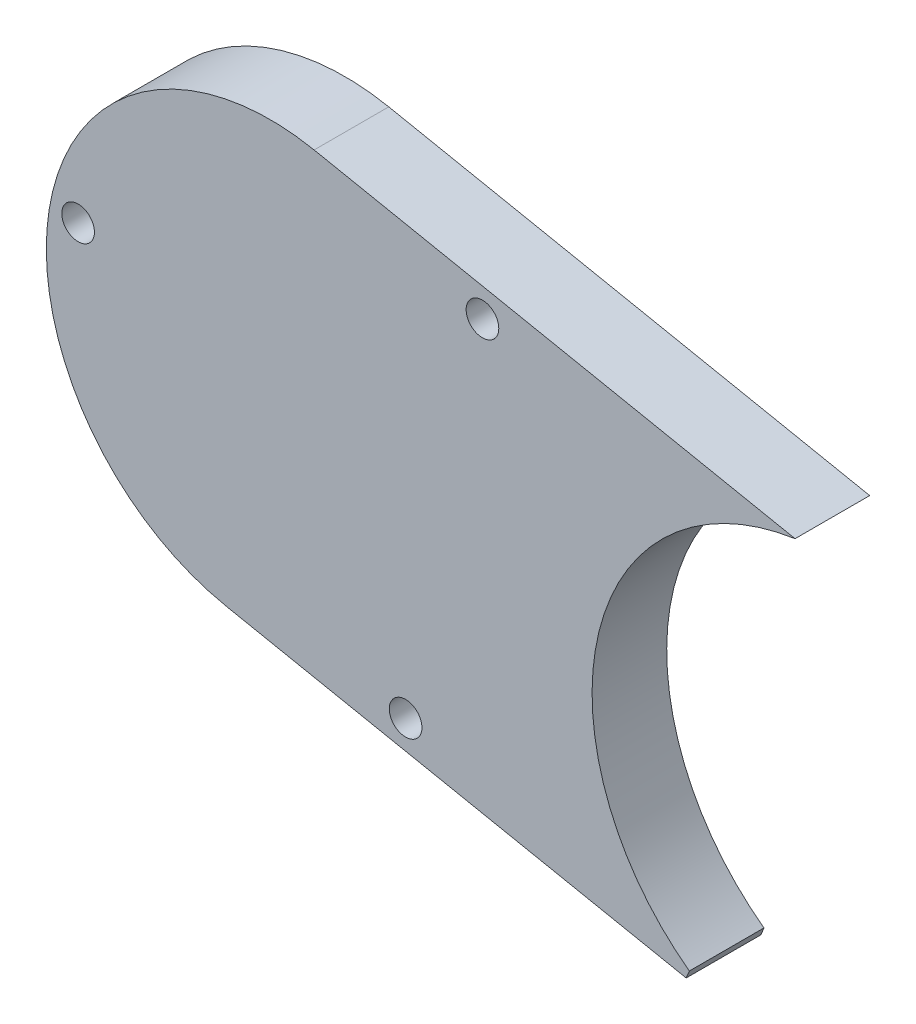
ISO-10303-21;
HEADER;
FILE_DESCRIPTION(('STEP AP214'),'2;1');
FILE_NAME('part.step','',(''),(''),'','','');
FILE_SCHEMA(('AUTOMOTIVE_DESIGN { 1 0 10303 214 1 1 1 1 }'));
ENDSEC;
DATA;
#1=APPLICATION_CONTEXT('core data for automotive mechanical design processes');
#2=APPLICATION_PROTOCOL_DEFINITION('international standard','automotive_design',2000,#1);
#3=PRODUCT_CONTEXT('',#1,'mechanical');
#4=PRODUCT('Part','Part','',(#3));
#5=PRODUCT_RELATED_PRODUCT_CATEGORY('part','',(#4));
#6=PRODUCT_DEFINITION_FORMATION('','',#4);
#7=PRODUCT_DEFINITION_CONTEXT('part definition',#1,'design');
#8=PRODUCT_DEFINITION('design','',#6,#7);
#9=PRODUCT_DEFINITION_SHAPE('','',#8);
#10=(LENGTH_UNIT() NAMED_UNIT(*) SI_UNIT(.MILLI.,.METRE.));
#11=(NAMED_UNIT(*) PLANE_ANGLE_UNIT() SI_UNIT($,.RADIAN.));
#12=(NAMED_UNIT(*) SI_UNIT($,.STERADIAN.) SOLID_ANGLE_UNIT());
#13=UNCERTAINTY_MEASURE_WITH_UNIT(LENGTH_MEASURE(1.E-05),#10,'distance_accuracy_value','');
#14=(GEOMETRIC_REPRESENTATION_CONTEXT(3) GLOBAL_UNCERTAINTY_ASSIGNED_CONTEXT((#13)) GLOBAL_UNIT_ASSIGNED_CONTEXT((#10,
#11,#12)) REPRESENTATION_CONTEXT('',''));
#15=CARTESIAN_POINT('',(0.,0.,0.));
#16=DIRECTION('',(0.,0.,1.));
#17=DIRECTION('',(1.,0.,0.));
#18=AXIS2_PLACEMENT_3D('',#15,#16,#17);
#19=CARTESIAN_POINT('',(-30.,6.,4.));
#20=DIRECTION('',(0.,0.,1.));
#21=DIRECTION('',(1.,0.,0.));
#22=AXIS2_PLACEMENT_3D('',#19,#20,#21);
#23=PLANE('',#22);
#24=DIRECTION('',(-0.384615384615378,-0.923076923076926,0.));
#25=VECTOR('',#24,1.);
#26=CARTESIAN_POINT('',(-5.07692307692305,-4.38461538461517,4.));
#27=LINE('',#26,#25);
#28=CARTESIAN_POINT('',(-7.53539758899759,-10.2849542135942,4.));
#29=VERTEX_POINT('',#28);
#30=CARTESIAN_POINT('',(-7.70678724331642,-10.6962893839594,4.));
#31=VERTEX_POINT('',#30);
#32=EDGE_CURVE('E94',#29,#31,#27,.T.);
#33=ORIENTED_EDGE('',*,*,#32,.F.);
#34=CARTESIAN_POINT('',(0.,0.,4.));
#35=DIRECTION('',(0.,0.,-1.));
#36=DIRECTION('',(1.,0.,0.));
#37=AXIS2_PLACEMENT_3D('',#34,#35,#36);
#38=CIRCLE('',#37,12.75);
#39=CARTESIAN_POINT('',(-1.8713617194601,12.6119191765147,4.));
#40=VERTEX_POINT('',#39);
#41=EDGE_CURVE('E128',#29,#40,#38,.T.);
#42=ORIENTED_EDGE('',*,*,#41,.T.);
#43=DIRECTION('',(-0.98058067569092,0.196116135138184,0.));
#44=VECTOR('',#43,1.);
#45=CARTESIAN_POINT('',(-27.6466063783418,17.766968108291,4.));
#46=LINE('',#45,#44);
#47=CARTESIAN_POINT('',(-27.6466063783418,17.766968108291,4.));
#48=VERTEX_POINT('',#47);
#49=EDGE_CURVE('E60',#40,#48,#46,.T.);
#50=ORIENTED_EDGE('',*,*,#49,.T.);
#51=CARTESIAN_POINT('',(-30.,6.,4.));
#52=DIRECTION('',(0.,0.,1.));
#53=DIRECTION('',(1.,0.,0.));
#54=AXIS2_PLACEMENT_3D('',#51,#52,#53);
#55=CIRCLE('',#54,12.);
#56=CARTESIAN_POINT('',(-32.3533936216582,-5.76696810829104,4.));
#57=VERTEX_POINT('',#56);
#58=EDGE_CURVE('E117',#48,#57,#55,.T.);
#59=ORIENTED_EDGE('',*,*,#58,.T.);
#60=DIRECTION('',(0.98058067569092,-0.196116135138184,0.));
#61=VECTOR('',#60,1.);
#62=CARTESIAN_POINT('',(-32.3533936216582,-5.76696810829104,4.));
#63=LINE('',#62,#61);
#64=EDGE_CURVE('E84',#57,#31,#63,.T.);
#65=ORIENTED_EDGE('',*,*,#64,.T.);
#66=EDGE_LOOP('',(#33,#42,#50,#59,#65));
#67=FACE_BOUND('',#66,.T.);
#68=CARTESIAN_POINT('',(-22.7437029998872,-6.15920037856734,4.));
#69=DIRECTION('',(0.,0.,1.));
#70=DIRECTION('',(1.,0.,0.));
#71=AXIS2_PLACEMENT_3D('',#68,#69,#70);
#72=CIRCLE('',#71,0.875000000000002);
#73=CARTESIAN_POINT('',(-21.8687029998872,-6.15920037856734,4.));
#74=VERTEX_POINT('',#73);
#75=EDGE_CURVE('E251',#74,#74,#72,.T.);
#76=ORIENTED_EDGE('',*,*,#75,.F.);
#77=EDGE_LOOP('',(#76));
#78=FACE_BOUND('',#77,.T.);
#79=CARTESIAN_POINT('',(-40.2960970947547,8.05921941895093,4.));
#80=DIRECTION('',(0.,0.,1.));
#81=DIRECTION('',(1.,0.,0.));
#82=AXIS2_PLACEMENT_3D('',#79,#80,#81);
#83=CIRCLE('',#82,0.874999999999998);
#84=CARTESIAN_POINT('',(-39.4210970947547,8.05921941895093,4.));
#85=VERTEX_POINT('',#84);
#86=EDGE_CURVE('E112',#85,#85,#83,.T.);
#87=ORIENTED_EDGE('',*,*,#86,.F.);
#88=EDGE_LOOP('',(#87));
#89=FACE_BOUND('',#88,.T.);
#90=CARTESIAN_POINT('',(-18.6252641619853,14.4329938109419,4.));
#91=DIRECTION('',(0.,0.,1.));
#92=DIRECTION('',(1.,0.,0.));
#93=AXIS2_PLACEMENT_3D('',#90,#91,#92);
#94=CIRCLE('',#93,0.875000000000002);
#95=CARTESIAN_POINT('',(-17.7502641619853,14.4329938109419,4.));
#96=VERTEX_POINT('',#95);
#97=EDGE_CURVE('E243',#96,#96,#94,.T.);
#98=ORIENTED_EDGE('',*,*,#97,.F.);
#99=EDGE_LOOP('',(#98));
#100=FACE_BOUND('',#99,.T.);
#101=ADVANCED_FACE('F37',(#67,#78,#89,#100),#23,.T.);
#102=CARTESIAN_POINT('',(-30.,6.,0.));
#103=DIRECTION('',(0.,0.,1.));
#104=DIRECTION('',(1.,0.,0.));
#105=AXIS2_PLACEMENT_3D('',#102,#103,#104);
#106=PLANE('',#105);
#107=CARTESIAN_POINT('',(0.,0.,0.));
#108=DIRECTION('',(0.,0.,-1.));
#109=DIRECTION('',(1.,0.,0.));
#110=AXIS2_PLACEMENT_3D('',#107,#108,#109);
#111=CIRCLE('',#110,12.75);
#112=CARTESIAN_POINT('',(-7.53539758899759,-10.2849542135942,0.));
#113=VERTEX_POINT('',#112);
#114=CARTESIAN_POINT('',(-1.8713617194601,12.6119191765147,0.));
#115=VERTEX_POINT('',#114);
#116=EDGE_CURVE('E104',#113,#115,#111,.T.);
#117=ORIENTED_EDGE('',*,*,#116,.F.);
#118=DIRECTION('',(0.384615384615378,0.923076923076926,0.));
#119=VECTOR('',#118,1.);
#120=CARTESIAN_POINT('',(-7.19230769230772,-9.46153846153849,0.));
#121=LINE('',#120,#119);
#122=CARTESIAN_POINT('',(-7.70678724331641,-10.6962893839594,0.));
#123=VERTEX_POINT('',#122);
#124=EDGE_CURVE('E52',#123,#113,#121,.T.);
#125=ORIENTED_EDGE('',*,*,#124,.F.);
#126=DIRECTION('',(0.98058067569092,-0.196116135138184,0.));
#127=VECTOR('',#126,1.);
#128=CARTESIAN_POINT('',(-32.3533936216582,-5.76696810829104,0.));
#129=LINE('',#128,#127);
#130=CARTESIAN_POINT('',(-32.3533936216582,-5.76696810829104,0.));
#131=VERTEX_POINT('',#130);
#132=EDGE_CURVE('E103',#131,#123,#129,.T.);
#133=ORIENTED_EDGE('',*,*,#132,.F.);
#134=CARTESIAN_POINT('',(-30.,6.,0.));
#135=DIRECTION('',(0.,0.,1.));
#136=DIRECTION('',(1.,0.,0.));
#137=AXIS2_PLACEMENT_3D('',#134,#135,#136);
#138=CIRCLE('',#137,12.);
#139=CARTESIAN_POINT('',(-27.6466063783418,17.766968108291,0.));
#140=VERTEX_POINT('',#139);
#141=EDGE_CURVE('E109',#140,#131,#138,.T.);
#142=ORIENTED_EDGE('',*,*,#141,.F.);
#143=DIRECTION('',(-0.98058067569092,0.196116135138184,0.));
#144=VECTOR('',#143,1.);
#145=CARTESIAN_POINT('',(-27.6466063783418,17.766968108291,0.));
#146=LINE('',#145,#144);
#147=EDGE_CURVE('E77',#115,#140,#146,.T.);
#148=ORIENTED_EDGE('',*,*,#147,.F.);
#149=EDGE_LOOP('',(#117,#125,#133,#142,#148));
#150=FACE_BOUND('',#149,.T.);
#151=CARTESIAN_POINT('',(-40.2960970947547,8.05921941895093,0.));
#152=DIRECTION('',(0.,0.,1.));
#153=DIRECTION('',(1.,0.,0.));
#154=AXIS2_PLACEMENT_3D('',#151,#152,#153);
#155=CIRCLE('',#154,0.874999999999998);
#156=CARTESIAN_POINT('',(-39.4210970947547,8.05921941895093,0.));
#157=VERTEX_POINT('',#156);
#158=EDGE_CURVE('E131',#157,#157,#155,.T.);
#159=ORIENTED_EDGE('',*,*,#158,.T.);
#160=EDGE_LOOP('',(#159));
#161=FACE_BOUND('',#160,.T.);
#162=CARTESIAN_POINT('',(-22.7437029998872,-6.15920037856734,0.));
#163=DIRECTION('',(0.,0.,1.));
#164=DIRECTION('',(1.,0.,0.));
#165=AXIS2_PLACEMENT_3D('',#162,#163,#164);
#166=CIRCLE('',#165,0.875000000000002);
#167=CARTESIAN_POINT('',(-21.8687029998872,-6.15920037856734,0.));
#168=VERTEX_POINT('',#167);
#169=EDGE_CURVE('E248',#168,#168,#166,.T.);
#170=ORIENTED_EDGE('',*,*,#169,.T.);
#171=EDGE_LOOP('',(#170));
#172=FACE_BOUND('',#171,.T.);
#173=CARTESIAN_POINT('',(-18.6252641619853,14.4329938109419,0.));
#174=DIRECTION('',(0.,0.,1.));
#175=DIRECTION('',(1.,0.,0.));
#176=AXIS2_PLACEMENT_3D('',#173,#174,#175);
#177=CIRCLE('',#176,0.875000000000002);
#178=CARTESIAN_POINT('',(-17.7502641619853,14.4329938109419,0.));
#179=VERTEX_POINT('',#178);
#180=EDGE_CURVE('E96',#179,#179,#177,.T.);
#181=ORIENTED_EDGE('',*,*,#180,.T.);
#182=EDGE_LOOP('',(#181));
#183=FACE_BOUND('',#182,.T.);
#184=ADVANCED_FACE('F100',(#150,#161,#172,#183),#106,.F.);
#185=CARTESIAN_POINT('',(-30.,6.,4.));
#186=DIRECTION('',(0.,0.,-1.));
#187=DIRECTION('',(-1.,0.,0.));
#188=AXIS2_PLACEMENT_3D('',#185,#186,#187);
#189=CYLINDRICAL_SURFACE('',#188,12.);
#190=ORIENTED_EDGE('',*,*,#141,.T.);
#191=DIRECTION('',(0.,0.,-1.));
#192=VECTOR('',#191,1.);
#193=CARTESIAN_POINT('',(-32.3533936216582,-5.76696810829104,4.));
#194=LINE('',#193,#192);
#195=EDGE_CURVE('E45',#57,#131,#194,.T.);
#196=ORIENTED_EDGE('',*,*,#195,.F.);
#197=ORIENTED_EDGE('',*,*,#58,.F.);
#198=DIRECTION('',(0.,0.,-1.));
#199=VECTOR('',#198,1.);
#200=CARTESIAN_POINT('',(-27.6466063783418,17.766968108291,4.));
#201=LINE('',#200,#199);
#202=EDGE_CURVE('E118',#48,#140,#201,.T.);
#203=ORIENTED_EDGE('',*,*,#202,.T.);
#204=EDGE_LOOP('',(#190,#196,#197,#203));
#205=FACE_BOUND('',#204,.T.);
#206=ADVANCED_FACE('F39',(#205),#189,.T.);
#207=CARTESIAN_POINT('',(-32.3533936216582,-5.76696810829104,4.));
#208=DIRECTION('',(0.196116135138184,0.98058067569092,0.));
#209=DIRECTION('',(-0.98058067569092,0.196116135138184,0.));
#210=AXIS2_PLACEMENT_3D('',#207,#208,#209);
#211=PLANE('',#210);
#212=ORIENTED_EDGE('',*,*,#132,.T.);
#213=DIRECTION('',(0.,0.,1.));
#214=VECTOR('',#213,1.);
#215=CARTESIAN_POINT('',(-7.70678724331642,-10.6962893839594,4.));
#216=LINE('',#215,#214);
#217=EDGE_CURVE('E91',#123,#31,#216,.T.);
#218=ORIENTED_EDGE('',*,*,#217,.T.);
#219=ORIENTED_EDGE('',*,*,#64,.F.);
#220=ORIENTED_EDGE('',*,*,#195,.T.);
#221=EDGE_LOOP('',(#212,#218,#219,#220));
#222=FACE_BOUND('',#221,.T.);
#223=ADVANCED_FACE('F106',(#222),#211,.F.);
#224=CARTESIAN_POINT('',(0.,0.,4.));
#225=DIRECTION('',(0.,0.,-1.));
#226=DIRECTION('',(-1.,0.,0.));
#227=AXIS2_PLACEMENT_3D('',#224,#225,#226);
#228=CYLINDRICAL_SURFACE('',#227,12.75);
#229=ORIENTED_EDGE('',*,*,#41,.F.);
#230=DIRECTION('',(0.,0.,-1.));
#231=VECTOR('',#230,1.);
#232=CARTESIAN_POINT('',(-7.53539758899759,-10.2849542135942,4.));
#233=LINE('',#232,#231);
#234=EDGE_CURVE('E11',#29,#113,#233,.T.);
#235=ORIENTED_EDGE('',*,*,#234,.T.);
#236=ORIENTED_EDGE('',*,*,#116,.T.);
#237=DIRECTION('',(0.,0.,-1.));
#238=VECTOR('',#237,1.);
#239=CARTESIAN_POINT('',(-1.8713617194601,12.6119191765147,4.));
#240=LINE('',#239,#238);
#241=EDGE_CURVE('E120',#40,#115,#240,.T.);
#242=ORIENTED_EDGE('',*,*,#241,.F.);
#243=EDGE_LOOP('',(#229,#235,#236,#242));
#244=FACE_BOUND('',#243,.T.);
#245=ADVANCED_FACE('F135',(#244),#228,.F.);
#246=CARTESIAN_POINT('',(-27.6466063783418,17.766968108291,4.));
#247=DIRECTION('',(-0.196116135138184,-0.98058067569092,0.));
#248=DIRECTION('',(0.98058067569092,-0.196116135138184,0.));
#249=AXIS2_PLACEMENT_3D('',#246,#247,#248);
#250=PLANE('',#249);
#251=ORIENTED_EDGE('',*,*,#147,.T.);
#252=ORIENTED_EDGE('',*,*,#202,.F.);
#253=ORIENTED_EDGE('',*,*,#49,.F.);
#254=ORIENTED_EDGE('',*,*,#241,.T.);
#255=EDGE_LOOP('',(#251,#252,#253,#254));
#256=FACE_BOUND('',#255,.T.);
#257=ADVANCED_FACE('F122',(#256),#250,.F.);
#258=CARTESIAN_POINT('',(-40.2960970947547,8.05921941895093,4.));
#259=DIRECTION('',(0.,0.,-1.));
#260=DIRECTION('',(-1.,0.,0.));
#261=AXIS2_PLACEMENT_3D('',#258,#259,#260);
#262=CYLINDRICAL_SURFACE('',#261,0.874999999999998);
#263=ORIENTED_EDGE('',*,*,#86,.T.);
#264=EDGE_LOOP('',(#263));
#265=FACE_BOUND('',#264,.T.);
#266=ORIENTED_EDGE('',*,*,#158,.F.);
#267=EDGE_LOOP('',(#266));
#268=FACE_BOUND('',#267,.T.);
#269=ADVANCED_FACE('F143',(#265,#268),#262,.F.);
#270=CARTESIAN_POINT('',(-22.7437029998872,-6.15920037856734,4.));
#271=DIRECTION('',(0.,0.,-1.));
#272=DIRECTION('',(-1.,0.,0.));
#273=AXIS2_PLACEMENT_3D('',#270,#271,#272);
#274=CYLINDRICAL_SURFACE('',#273,0.875000000000002);
#275=ORIENTED_EDGE('',*,*,#75,.T.);
#276=EDGE_LOOP('',(#275));
#277=FACE_BOUND('',#276,.T.);
#278=ORIENTED_EDGE('',*,*,#169,.F.);
#279=EDGE_LOOP('',(#278));
#280=FACE_BOUND('',#279,.T.);
#281=ADVANCED_FACE('F155',(#277,#280),#274,.F.);
#282=CARTESIAN_POINT('',(-18.6252641619853,14.4329938109419,4.));
#283=DIRECTION('',(0.,0.,-1.));
#284=DIRECTION('',(-1.,0.,0.));
#285=AXIS2_PLACEMENT_3D('',#282,#283,#284);
#286=CYLINDRICAL_SURFACE('',#285,0.875000000000002);
#287=ORIENTED_EDGE('',*,*,#97,.T.);
#288=EDGE_LOOP('',(#287));
#289=FACE_BOUND('',#288,.T.);
#290=ORIENTED_EDGE('',*,*,#180,.F.);
#291=EDGE_LOOP('',(#290));
#292=FACE_BOUND('',#291,.T.);
#293=ADVANCED_FACE('F159',(#289,#292),#286,.F.);
#294=CARTESIAN_POINT('',(-7.19230769230772,-9.46153846153849,10.));
#295=DIRECTION('',(-0.923076923076926,0.384615384615378,0.));
#296=DIRECTION('',(-0.384615384615378,-0.923076923076926,0.));
#297=AXIS2_PLACEMENT_3D('',#294,#295,#296);
#298=PLANE('',#297);
#299=ORIENTED_EDGE('',*,*,#124,.T.);
#300=ORIENTED_EDGE('',*,*,#234,.F.);
#301=ORIENTED_EDGE('',*,*,#32,.T.);
#302=ORIENTED_EDGE('',*,*,#217,.F.);
#303=EDGE_LOOP('',(#299,#300,#301,#302));
#304=FACE_BOUND('',#303,.T.);
#305=ADVANCED_FACE('F92',(#304),#298,.F.);
#306=CLOSED_SHELL('',(#101,#184,#206,#223,#245,#257,#269,#281,#293,#305));
#307=MANIFOLD_SOLID_BREP('B2',#306);
#308=ADVANCED_BREP_SHAPE_REPRESENTATION('',(#18,#307),#14);
#309=SHAPE_DEFINITION_REPRESENTATION(#9,#308);
ENDSEC;
END-ISO-10303-21;
